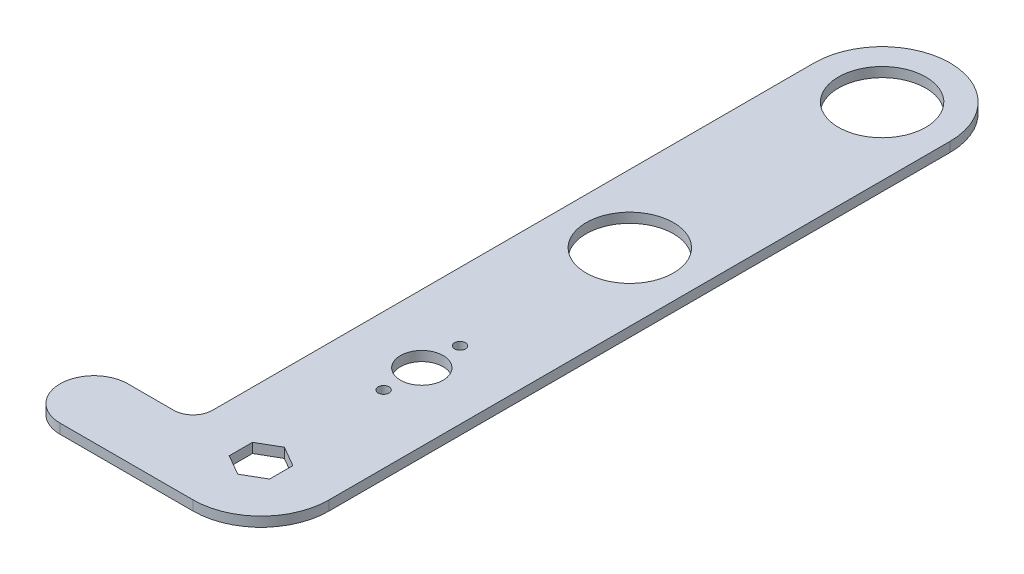
ISO-10303-21;
HEADER;
FILE_DESCRIPTION(('STEP AP214'),'2;1');
FILE_NAME('part.step','',(''),(''),'','','');
FILE_SCHEMA(('AUTOMOTIVE_DESIGN { 1 0 10303 214 1 1 1 1 }'));
ENDSEC;
DATA;
#1=APPLICATION_CONTEXT('core data for automotive mechanical design processes');
#2=APPLICATION_PROTOCOL_DEFINITION('international standard','automotive_design',2000,#1);
#3=PRODUCT_CONTEXT('',#1,'mechanical');
#4=PRODUCT('Part','Part','',(#3));
#5=PRODUCT_RELATED_PRODUCT_CATEGORY('part','',(#4));
#6=PRODUCT_DEFINITION_FORMATION('','',#4);
#7=PRODUCT_DEFINITION_CONTEXT('part definition',#1,'design');
#8=PRODUCT_DEFINITION('design','',#6,#7);
#9=PRODUCT_DEFINITION_SHAPE('','',#8);
#10=(LENGTH_UNIT() NAMED_UNIT(*) SI_UNIT(.MILLI.,.METRE.));
#11=(NAMED_UNIT(*) PLANE_ANGLE_UNIT() SI_UNIT($,.RADIAN.));
#12=(NAMED_UNIT(*) SI_UNIT($,.STERADIAN.) SOLID_ANGLE_UNIT());
#13=UNCERTAINTY_MEASURE_WITH_UNIT(LENGTH_MEASURE(1.E-05),#10,'distance_accuracy_value','');
#14=(GEOMETRIC_REPRESENTATION_CONTEXT(3) GLOBAL_UNCERTAINTY_ASSIGNED_CONTEXT((#13)) GLOBAL_UNIT_ASSIGNED_CONTEXT((#10,
#11,#12)) REPRESENTATION_CONTEXT('',''));
#15=CARTESIAN_POINT('',(0.,0.,0.));
#16=DIRECTION('',(0.,0.,1.));
#17=DIRECTION('',(1.,0.,0.));
#18=AXIS2_PLACEMENT_3D('',#15,#16,#17);
#19=CARTESIAN_POINT('',(22.225,3.175,-203.2));
#20=DIRECTION('',(0.,1.,0.));
#21=DIRECTION('',(0.,0.,-1.));
#22=AXIS2_PLACEMENT_3D('',#19,#20,#21);
#23=PLANE('',#22);
#24=CARTESIAN_POINT('',(22.225,3.175,-40.10406));
#25=DIRECTION('',(0.,-1.,0.));
#26=DIRECTION('',(0.,0.,-1.));
#27=AXIS2_PLACEMENT_3D('',#24,#25,#26);
#28=CIRCLE('',#27,1.778);
#29=CARTESIAN_POINT('',(22.225,3.175,-41.88206));
#30=VERTEX_POINT('',#29);
#31=EDGE_CURVE('E366',#30,#30,#28,.T.);
#32=ORIENTED_EDGE('',*,*,#31,.T.);
#33=EDGE_LOOP('',(#32));
#34=FACE_BOUND('',#33,.T.);
#35=DIRECTION('',(0.866025403784438,0.,0.5));
#36=VECTOR('',#35,1.);
#37=CARTESIAN_POINT('',(22.225,3.175,-7.62564235545658));
#38=LINE('',#37,#36);
#39=CARTESIAN_POINT('',(22.225,3.175,-7.62564235545658));
#40=VERTEX_POINT('',#39);
#41=CARTESIAN_POINT('',(28.829,3.175,-3.81282117772829));
#42=VERTEX_POINT('',#41);
#43=EDGE_CURVE('E154',#40,#42,#38,.T.);
#44=ORIENTED_EDGE('',*,*,#43,.T.);
#45=DIRECTION('',(0.,0.,1.));
#46=VECTOR('',#45,1.);
#47=CARTESIAN_POINT('',(28.829,3.175,-3.81282117772829));
#48=LINE('',#47,#46);
#49=CARTESIAN_POINT('',(28.829,3.175,3.81282117772829));
#50=VERTEX_POINT('',#49);
#51=EDGE_CURVE('E161',#42,#50,#48,.T.);
#52=ORIENTED_EDGE('',*,*,#51,.T.);
#53=DIRECTION('',(-0.866025403784439,0.,0.5));
#54=VECTOR('',#53,1.);
#55=CARTESIAN_POINT('',(28.829,3.175,3.81282117772829));
#56=LINE('',#55,#54);
#57=CARTESIAN_POINT('',(22.225,3.175,7.62564235545658));
#58=VERTEX_POINT('',#57);
#59=EDGE_CURVE('E163',#50,#58,#56,.T.);
#60=ORIENTED_EDGE('',*,*,#59,.T.);
#61=DIRECTION('',(-0.866025403784438,0.,-0.5));
#62=VECTOR('',#61,1.);
#63=CARTESIAN_POINT('',(22.225,3.175,7.62564235545658));
#64=LINE('',#63,#62);
#65=CARTESIAN_POINT('',(15.621,3.175,3.8128211777283));
#66=VERTEX_POINT('',#65);
#67=EDGE_CURVE('E169',#58,#66,#64,.T.);
#68=ORIENTED_EDGE('',*,*,#67,.T.);
#69=DIRECTION('',(0.,0.,-1.));
#70=VECTOR('',#69,1.);
#71=CARTESIAN_POINT('',(15.621,3.175,3.81282117772829));
#72=LINE('',#71,#70);
#73=CARTESIAN_POINT('',(15.621,3.175,-3.81282117772829));
#74=VERTEX_POINT('',#73);
#75=EDGE_CURVE('E156',#66,#74,#72,.T.);
#76=ORIENTED_EDGE('',*,*,#75,.T.);
#77=DIRECTION('',(0.866025403784439,0.,-0.5));
#78=VECTOR('',#77,1.);
#79=CARTESIAN_POINT('',(15.621,3.175,-3.81282117772829));
#80=LINE('',#79,#78);
#81=EDGE_CURVE('E139',#74,#40,#80,.T.);
#82=ORIENTED_EDGE('',*,*,#81,.T.);
#83=EDGE_LOOP('',(#44,#52,#60,#68,#76,#82));
#84=FACE_BOUND('',#83,.T.);
#85=CARTESIAN_POINT('',(22.225,3.175,-120.65));
#86=DIRECTION('',(0.,-1.,0.));
#87=DIRECTION('',(0.,0.,-1.));
#88=AXIS2_PLACEMENT_3D('',#85,#86,#87);
#89=CIRCLE('',#88,14.2875);
#90=CARTESIAN_POINT('',(22.225,3.175,-134.9375));
#91=VERTEX_POINT('',#90);
#92=EDGE_CURVE('E192',#91,#91,#89,.T.);
#93=ORIENTED_EDGE('',*,*,#92,.T.);
#94=EDGE_LOOP('',(#93));
#95=FACE_BOUND('',#94,.T.);
#96=CARTESIAN_POINT('',(22.225,3.175,-203.2));
#97=DIRECTION('',(0.,-1.,0.));
#98=DIRECTION('',(0.,0.,-1.));
#99=AXIS2_PLACEMENT_3D('',#96,#97,#98);
#100=CIRCLE('',#99,22.225);
#101=CARTESIAN_POINT('',(0.,3.175,-203.2));
#102=VERTEX_POINT('',#101);
#103=CARTESIAN_POINT('',(44.45,3.175,-203.2));
#104=VERTEX_POINT('',#103);
#105=EDGE_CURVE('E204',#102,#104,#100,.T.);
#106=ORIENTED_EDGE('',*,*,#105,.F.);
#107=DIRECTION('',(0.,0.,-1.));
#108=VECTOR('',#107,1.);
#109=CARTESIAN_POINT('',(0.,3.175,-6.35000000000004));
#110=LINE('',#109,#108);
#111=CARTESIAN_POINT('',(0.,3.175,-6.35000000000004));
#112=VERTEX_POINT('',#111);
#113=EDGE_CURVE('E226',#112,#102,#110,.T.);
#114=ORIENTED_EDGE('',*,*,#113,.F.);
#115=CARTESIAN_POINT('',(-6.35,3.175,-6.35));
#116=DIRECTION('',(0.,1.,0.));
#117=DIRECTION('',(0.,0.,1.));
#118=AXIS2_PLACEMENT_3D('',#115,#116,#117);
#119=CIRCLE('',#118,6.35);
#120=CARTESIAN_POINT('',(-6.35000000000004,3.175,0.));
#121=VERTEX_POINT('',#120);
#122=EDGE_CURVE('E223',#121,#112,#119,.T.);
#123=ORIENTED_EDGE('',*,*,#122,.F.);
#124=DIRECTION('',(1.,0.,0.));
#125=VECTOR('',#124,1.);
#126=CARTESIAN_POINT('',(-6.35000000000004,3.175,0.));
#127=LINE('',#126,#125);
#128=CARTESIAN_POINT('',(-21.3329954351355,3.175,0.));
#129=VERTEX_POINT('',#128);
#130=EDGE_CURVE('E220',#129,#121,#127,.T.);
#131=ORIENTED_EDGE('',*,*,#130,.F.);
#132=CARTESIAN_POINT('',(-21.3329954351355,3.175,11.1125));
#133=DIRECTION('',(0.,-1.,0.));
#134=DIRECTION('',(0.,0.,-1.));
#135=AXIS2_PLACEMENT_3D('',#132,#133,#134);
#136=CIRCLE('',#135,11.1125);
#137=CARTESIAN_POINT('',(-21.3329954351354,3.175,22.225));
#138=VERTEX_POINT('',#137);
#139=EDGE_CURVE('E217',#138,#129,#136,.T.);
#140=ORIENTED_EDGE('',*,*,#139,.F.);
#141=DIRECTION('',(-1.,0.,0.));
#142=VECTOR('',#141,1.);
#143=CARTESIAN_POINT('',(22.225,3.175,22.225));
#144=LINE('',#143,#142);
#145=CARTESIAN_POINT('',(22.225,3.175,22.225));
#146=VERTEX_POINT('',#145);
#147=EDGE_CURVE('E214',#146,#138,#144,.T.);
#148=ORIENTED_EDGE('',*,*,#147,.F.);
#149=CARTESIAN_POINT('',(22.225,3.175,0.));
#150=DIRECTION('',(0.,-1.,0.));
#151=DIRECTION('',(0.,0.,1.));
#152=AXIS2_PLACEMENT_3D('',#149,#150,#151);
#153=CIRCLE('',#152,22.225);
#154=CARTESIAN_POINT('',(44.45,3.175,0.));
#155=VERTEX_POINT('',#154);
#156=EDGE_CURVE('E211',#155,#146,#153,.T.);
#157=ORIENTED_EDGE('',*,*,#156,.F.);
#158=DIRECTION('',(0.,0.,1.));
#159=VECTOR('',#158,1.);
#160=CARTESIAN_POINT('',(44.45,3.175,0.));
#161=LINE('',#160,#159);
#162=EDGE_CURVE('E207',#104,#155,#161,.T.);
#163=ORIENTED_EDGE('',*,*,#162,.F.);
#164=EDGE_LOOP('',(#106,#114,#123,#131,#140,#148,#157,#163));
#165=FACE_BOUND('',#164,.T.);
#166=CARTESIAN_POINT('',(22.225,3.175,-203.2));
#167=DIRECTION('',(0.,-1.,0.));
#168=DIRECTION('',(0.,0.,-1.));
#169=AXIS2_PLACEMENT_3D('',#166,#167,#168);
#170=CIRCLE('',#169,14.2875);
#171=CARTESIAN_POINT('',(22.225,3.175,-217.4875));
#172=VERTEX_POINT('',#171);
#173=EDGE_CURVE('E198',#172,#172,#170,.T.);
#174=ORIENTED_EDGE('',*,*,#173,.T.);
#175=EDGE_LOOP('',(#174));
#176=FACE_BOUND('',#175,.T.);
#177=CARTESIAN_POINT('',(22.225,3.175,-52.6034));
#178=DIRECTION('',(0.,-1.,0.));
#179=DIRECTION('',(0.,0.,-1.));
#180=AXIS2_PLACEMENT_3D('',#177,#178,#179);
#181=CIRCLE('',#180,6.985);
#182=CARTESIAN_POINT('',(22.225,3.175,-59.5884));
#183=VERTEX_POINT('',#182);
#184=EDGE_CURVE('E174',#183,#183,#181,.T.);
#185=ORIENTED_EDGE('',*,*,#184,.T.);
#186=EDGE_LOOP('',(#185));
#187=FACE_BOUND('',#186,.T.);
#188=CARTESIAN_POINT('',(22.225,3.175,-65.10274));
#189=DIRECTION('',(0.,-1.,0.));
#190=DIRECTION('',(0.,0.,-1.));
#191=AXIS2_PLACEMENT_3D('',#188,#189,#190);
#192=CIRCLE('',#191,1.778);
#193=CARTESIAN_POINT('',(22.225,3.175,-66.88074));
#194=VERTEX_POINT('',#193);
#195=EDGE_CURVE('E357',#194,#194,#192,.T.);
#196=ORIENTED_EDGE('',*,*,#195,.T.);
#197=EDGE_LOOP('',(#196));
#198=FACE_BOUND('',#197,.T.);
#199=ADVANCED_FACE('F37',(#34,#84,#95,#165,#176,#187,#198),#23,.T.);
#200=CARTESIAN_POINT('',(22.225,0.,-203.2));
#201=DIRECTION('',(0.,1.,0.));
#202=DIRECTION('',(0.,0.,-1.));
#203=AXIS2_PLACEMENT_3D('',#200,#201,#202);
#204=PLANE('',#203);
#205=CARTESIAN_POINT('',(22.225,0.,-120.65));
#206=DIRECTION('',(0.,-1.,0.));
#207=DIRECTION('',(0.,0.,-1.));
#208=AXIS2_PLACEMENT_3D('',#205,#206,#207);
#209=CIRCLE('',#208,14.2875);
#210=CARTESIAN_POINT('',(22.225,0.,-134.9375));
#211=VERTEX_POINT('',#210);
#212=EDGE_CURVE('E147',#211,#211,#209,.T.);
#213=ORIENTED_EDGE('',*,*,#212,.F.);
#214=EDGE_LOOP('',(#213));
#215=FACE_BOUND('',#214,.T.);
#216=CARTESIAN_POINT('',(22.225,0.,-203.2));
#217=DIRECTION('',(0.,-1.,0.));
#218=DIRECTION('',(0.,0.,-1.));
#219=AXIS2_PLACEMENT_3D('',#216,#217,#218);
#220=CIRCLE('',#219,14.2875);
#221=CARTESIAN_POINT('',(22.225,0.,-217.4875));
#222=VERTEX_POINT('',#221);
#223=EDGE_CURVE('E195',#222,#222,#220,.T.);
#224=ORIENTED_EDGE('',*,*,#223,.F.);
#225=EDGE_LOOP('',(#224));
#226=FACE_BOUND('',#225,.T.);
#227=CARTESIAN_POINT('',(22.225,0.,-203.2));
#228=DIRECTION('',(0.,-1.,0.));
#229=DIRECTION('',(0.,0.,-1.));
#230=AXIS2_PLACEMENT_3D('',#227,#228,#229);
#231=CIRCLE('',#230,22.225);
#232=CARTESIAN_POINT('',(0.,0.,-203.2));
#233=VERTEX_POINT('',#232);
#234=CARTESIAN_POINT('',(44.45,0.,-203.2));
#235=VERTEX_POINT('',#234);
#236=EDGE_CURVE('E201',#233,#235,#231,.T.);
#237=ORIENTED_EDGE('',*,*,#236,.T.);
#238=DIRECTION('',(0.,0.,1.));
#239=VECTOR('',#238,1.);
#240=CARTESIAN_POINT('',(44.45,0.,0.));
#241=LINE('',#240,#239);
#242=CARTESIAN_POINT('',(44.45,0.,0.));
#243=VERTEX_POINT('',#242);
#244=EDGE_CURVE('E232',#235,#243,#241,.T.);
#245=ORIENTED_EDGE('',*,*,#244,.T.);
#246=CARTESIAN_POINT('',(22.225,0.,0.));
#247=DIRECTION('',(0.,-1.,0.));
#248=DIRECTION('',(0.,0.,1.));
#249=AXIS2_PLACEMENT_3D('',#246,#247,#248);
#250=CIRCLE('',#249,22.225);
#251=CARTESIAN_POINT('',(22.225,0.,22.225));
#252=VERTEX_POINT('',#251);
#253=EDGE_CURVE('E235',#243,#252,#250,.T.);
#254=ORIENTED_EDGE('',*,*,#253,.T.);
#255=DIRECTION('',(-1.,0.,0.));
#256=VECTOR('',#255,1.);
#257=CARTESIAN_POINT('',(22.225,0.,22.225));
#258=LINE('',#257,#256);
#259=CARTESIAN_POINT('',(-21.3329954351354,0.,22.225));
#260=VERTEX_POINT('',#259);
#261=EDGE_CURVE('E238',#252,#260,#258,.T.);
#262=ORIENTED_EDGE('',*,*,#261,.T.);
#263=CARTESIAN_POINT('',(-21.3329954351355,0.,11.1125));
#264=DIRECTION('',(0.,-1.,0.));
#265=DIRECTION('',(0.,0.,-1.));
#266=AXIS2_PLACEMENT_3D('',#263,#264,#265);
#267=CIRCLE('',#266,11.1125);
#268=CARTESIAN_POINT('',(-21.3329954351355,0.,0.));
#269=VERTEX_POINT('',#268);
#270=EDGE_CURVE('E241',#260,#269,#267,.T.);
#271=ORIENTED_EDGE('',*,*,#270,.T.);
#272=DIRECTION('',(1.,0.,0.));
#273=VECTOR('',#272,1.);
#274=CARTESIAN_POINT('',(-6.35000000000004,0.,0.));
#275=LINE('',#274,#273);
#276=CARTESIAN_POINT('',(-6.35000000000004,0.,0.));
#277=VERTEX_POINT('',#276);
#278=EDGE_CURVE('E244',#269,#277,#275,.T.);
#279=ORIENTED_EDGE('',*,*,#278,.T.);
#280=CARTESIAN_POINT('',(-6.35,0.,-6.35));
#281=DIRECTION('',(0.,1.,0.));
#282=DIRECTION('',(0.,0.,1.));
#283=AXIS2_PLACEMENT_3D('',#280,#281,#282);
#284=CIRCLE('',#283,6.35);
#285=CARTESIAN_POINT('',(0.,0.,-6.35000000000004));
#286=VERTEX_POINT('',#285);
#287=EDGE_CURVE('E247',#277,#286,#284,.T.);
#288=ORIENTED_EDGE('',*,*,#287,.T.);
#289=DIRECTION('',(0.,0.,-1.));
#290=VECTOR('',#289,1.);
#291=CARTESIAN_POINT('',(0.,0.,-6.35000000000004));
#292=LINE('',#291,#290);
#293=EDGE_CURVE('E208',#286,#233,#292,.T.);
#294=ORIENTED_EDGE('',*,*,#293,.T.);
#295=EDGE_LOOP('',(#237,#245,#254,#262,#271,#279,#288,#294));
#296=FACE_BOUND('',#295,.T.);
#297=DIRECTION('',(0.866025403784439,0.,-0.5));
#298=VECTOR('',#297,1.);
#299=CARTESIAN_POINT('',(15.621,0.,-3.81282117772829));
#300=LINE('',#299,#298);
#301=CARTESIAN_POINT('',(15.621,0.,-3.8128211777283));
#302=VERTEX_POINT('',#301);
#303=CARTESIAN_POINT('',(22.225,0.,-7.62564235545658));
#304=VERTEX_POINT('',#303);
#305=EDGE_CURVE('E142',#302,#304,#300,.T.);
#306=ORIENTED_EDGE('',*,*,#305,.F.);
#307=DIRECTION('',(0.,0.,-1.));
#308=VECTOR('',#307,1.);
#309=CARTESIAN_POINT('',(15.621,0.,3.81282117772829));
#310=LINE('',#309,#308);
#311=CARTESIAN_POINT('',(15.621,0.,3.81282117772829));
#312=VERTEX_POINT('',#311);
#313=EDGE_CURVE('E157',#312,#302,#310,.T.);
#314=ORIENTED_EDGE('',*,*,#313,.F.);
#315=DIRECTION('',(-0.866025403784438,0.,-0.5));
#316=VECTOR('',#315,1.);
#317=CARTESIAN_POINT('',(22.225,0.,7.62564235545658));
#318=LINE('',#317,#316);
#319=CARTESIAN_POINT('',(22.225,0.,7.62564235545658));
#320=VERTEX_POINT('',#319);
#321=EDGE_CURVE('E182',#320,#312,#318,.T.);
#322=ORIENTED_EDGE('',*,*,#321,.F.);
#323=DIRECTION('',(-0.866025403784439,0.,0.5));
#324=VECTOR('',#323,1.);
#325=CARTESIAN_POINT('',(28.829,0.,3.81282117772829));
#326=LINE('',#325,#324);
#327=CARTESIAN_POINT('',(28.829,0.,3.81282117772829));
#328=VERTEX_POINT('',#327);
#329=EDGE_CURVE('E179',#328,#320,#326,.T.);
#330=ORIENTED_EDGE('',*,*,#329,.F.);
#331=DIRECTION('',(0.,0.,1.));
#332=VECTOR('',#331,1.);
#333=CARTESIAN_POINT('',(28.829,0.,-3.81282117772829));
#334=LINE('',#333,#332);
#335=CARTESIAN_POINT('',(28.829,0.,-3.81282117772829));
#336=VERTEX_POINT('',#335);
#337=EDGE_CURVE('E176',#336,#328,#334,.T.);
#338=ORIENTED_EDGE('',*,*,#337,.F.);
#339=DIRECTION('',(0.866025403784438,0.,0.5));
#340=VECTOR('',#339,1.);
#341=CARTESIAN_POINT('',(22.225,0.,-7.62564235545658));
#342=LINE('',#341,#340);
#343=EDGE_CURVE('E173',#304,#336,#342,.T.);
#344=ORIENTED_EDGE('',*,*,#343,.F.);
#345=EDGE_LOOP('',(#306,#314,#322,#330,#338,#344));
#346=FACE_BOUND('',#345,.T.);
#347=CARTESIAN_POINT('',(22.225,0.,-52.6034));
#348=DIRECTION('',(0.,-1.,0.));
#349=DIRECTION('',(0.,0.,-1.));
#350=AXIS2_PLACEMENT_3D('',#347,#348,#349);
#351=CIRCLE('',#350,6.985);
#352=CARTESIAN_POINT('',(22.225,0.,-59.5884));
#353=VERTEX_POINT('',#352);
#354=EDGE_CURVE('E368',#353,#353,#351,.T.);
#355=ORIENTED_EDGE('',*,*,#354,.F.);
#356=EDGE_LOOP('',(#355));
#357=FACE_BOUND('',#356,.T.);
#358=CARTESIAN_POINT('',(22.225,0.,-40.10406));
#359=DIRECTION('',(0.,-1.,0.));
#360=DIRECTION('',(0.,0.,-1.));
#361=AXIS2_PLACEMENT_3D('',#358,#359,#360);
#362=CIRCLE('',#361,1.778);
#363=CARTESIAN_POINT('',(22.225,0.,-41.88206));
#364=VERTEX_POINT('',#363);
#365=EDGE_CURVE('E363',#364,#364,#362,.T.);
#366=ORIENTED_EDGE('',*,*,#365,.F.);
#367=EDGE_LOOP('',(#366));
#368=FACE_BOUND('',#367,.T.);
#369=CARTESIAN_POINT('',(22.225,0.,-65.10274));
#370=DIRECTION('',(0.,-1.,0.));
#371=DIRECTION('',(0.,0.,-1.));
#372=AXIS2_PLACEMENT_3D('',#369,#370,#371);
#373=CIRCLE('',#372,1.778);
#374=CARTESIAN_POINT('',(22.225,0.,-66.88074));
#375=VERTEX_POINT('',#374);
#376=EDGE_CURVE('E360',#375,#375,#373,.T.);
#377=ORIENTED_EDGE('',*,*,#376,.F.);
#378=EDGE_LOOP('',(#377));
#379=FACE_BOUND('',#378,.T.);
#380=ADVANCED_FACE('F272',(#215,#226,#296,#346,#357,#368,#379),#204,.F.);
#381=CARTESIAN_POINT('',(22.225,3.175,-203.2));
#382=DIRECTION('',(0.,-1.,0.));
#383=DIRECTION('',(0.,0.,1.));
#384=AXIS2_PLACEMENT_3D('',#381,#382,#383);
#385=CYLINDRICAL_SURFACE('',#384,22.225);
#386=ORIENTED_EDGE('',*,*,#236,.F.);
#387=DIRECTION('',(0.,-1.,0.));
#388=VECTOR('',#387,1.);
#389=CARTESIAN_POINT('',(0.,3.175,-203.2));
#390=LINE('',#389,#388);
#391=EDGE_CURVE('E229',#102,#233,#390,.T.);
#392=ORIENTED_EDGE('',*,*,#391,.F.);
#393=ORIENTED_EDGE('',*,*,#105,.T.);
#394=DIRECTION('',(0.,-1.,0.));
#395=VECTOR('',#394,1.);
#396=CARTESIAN_POINT('',(44.45,3.175,-203.2));
#397=LINE('',#396,#395);
#398=EDGE_CURVE('E11',#104,#235,#397,.T.);
#399=ORIENTED_EDGE('',*,*,#398,.T.);
#400=EDGE_LOOP('',(#386,#392,#393,#399));
#401=FACE_BOUND('',#400,.T.);
#402=ADVANCED_FACE('F39',(#401),#385,.T.);
#403=CARTESIAN_POINT('',(44.45,3.175,0.));
#404=DIRECTION('',(-1.,0.,0.));
#405=DIRECTION('',(0.,0.,-1.));
#406=AXIS2_PLACEMENT_3D('',#403,#404,#405);
#407=PLANE('',#406);
#408=ORIENTED_EDGE('',*,*,#244,.F.);
#409=ORIENTED_EDGE('',*,*,#398,.F.);
#410=ORIENTED_EDGE('',*,*,#162,.T.);
#411=DIRECTION('',(0.,-1.,0.));
#412=VECTOR('',#411,1.);
#413=CARTESIAN_POINT('',(44.45,3.175,0.));
#414=LINE('',#413,#412);
#415=EDGE_CURVE('E45',#155,#243,#414,.T.);
#416=ORIENTED_EDGE('',*,*,#415,.T.);
#417=EDGE_LOOP('',(#408,#409,#410,#416));
#418=FACE_BOUND('',#417,.T.);
#419=ADVANCED_FACE('F265',(#418),#407,.F.);
#420=CARTESIAN_POINT('',(22.225,3.175,0.));
#421=DIRECTION('',(0.,-1.,0.));
#422=DIRECTION('',(0.,0.,1.));
#423=AXIS2_PLACEMENT_3D('',#420,#421,#422);
#424=CYLINDRICAL_SURFACE('',#423,22.225);
#425=ORIENTED_EDGE('',*,*,#253,.F.);
#426=ORIENTED_EDGE('',*,*,#415,.F.);
#427=ORIENTED_EDGE('',*,*,#156,.T.);
#428=DIRECTION('',(0.,-1.,0.));
#429=VECTOR('',#428,1.);
#430=CARTESIAN_POINT('',(22.225,3.175,22.225));
#431=LINE('',#430,#429);
#432=EDGE_CURVE('E261',#146,#252,#431,.T.);
#433=ORIENTED_EDGE('',*,*,#432,.T.);
#434=EDGE_LOOP('',(#425,#426,#427,#433));
#435=FACE_BOUND('',#434,.T.);
#436=ADVANCED_FACE('F269',(#435),#424,.T.);
#437=CARTESIAN_POINT('',(22.225,3.175,22.225));
#438=DIRECTION('',(0.,0.,-1.));
#439=DIRECTION('',(1.,0.,0.));
#440=AXIS2_PLACEMENT_3D('',#437,#438,#439);
#441=PLANE('',#440);
#442=ORIENTED_EDGE('',*,*,#261,.F.);
#443=ORIENTED_EDGE('',*,*,#432,.F.);
#444=ORIENTED_EDGE('',*,*,#147,.T.);
#445=DIRECTION('',(0.,-1.,0.));
#446=VECTOR('',#445,1.);
#447=CARTESIAN_POINT('',(-21.3329954351354,3.175,22.225));
#448=LINE('',#447,#446);
#449=EDGE_CURVE('E259',#138,#260,#448,.T.);
#450=ORIENTED_EDGE('',*,*,#449,.T.);
#451=EDGE_LOOP('',(#442,#443,#444,#450));
#452=FACE_BOUND('',#451,.T.);
#453=ADVANCED_FACE('F285',(#452),#441,.F.);
#454=CARTESIAN_POINT('',(-21.3329954351355,3.175,11.1125));
#455=DIRECTION('',(0.,-1.,0.));
#456=DIRECTION('',(0.,0.,1.));
#457=AXIS2_PLACEMENT_3D('',#454,#455,#456);
#458=CYLINDRICAL_SURFACE('',#457,11.1125);
#459=ORIENTED_EDGE('',*,*,#270,.F.);
#460=ORIENTED_EDGE('',*,*,#449,.F.);
#461=ORIENTED_EDGE('',*,*,#139,.T.);
#462=DIRECTION('',(0.,-1.,0.));
#463=VECTOR('',#462,1.);
#464=CARTESIAN_POINT('',(-21.3329954351355,3.175,0.));
#465=LINE('',#464,#463);
#466=EDGE_CURVE('E257',#129,#269,#465,.T.);
#467=ORIENTED_EDGE('',*,*,#466,.T.);
#468=EDGE_LOOP('',(#459,#460,#461,#467));
#469=FACE_BOUND('',#468,.T.);
#470=ADVANCED_FACE('F289',(#469),#458,.T.);
#471=CARTESIAN_POINT('',(-6.35000000000004,3.175,0.));
#472=DIRECTION('',(0.,0.,1.));
#473=DIRECTION('',(-1.,0.,0.));
#474=AXIS2_PLACEMENT_3D('',#471,#472,#473);
#475=PLANE('',#474);
#476=ORIENTED_EDGE('',*,*,#278,.F.);
#477=ORIENTED_EDGE('',*,*,#466,.F.);
#478=ORIENTED_EDGE('',*,*,#130,.T.);
#479=DIRECTION('',(0.,-1.,0.));
#480=VECTOR('',#479,1.);
#481=CARTESIAN_POINT('',(-6.35000000000004,3.175,0.));
#482=LINE('',#481,#480);
#483=EDGE_CURVE('E255',#121,#277,#482,.T.);
#484=ORIENTED_EDGE('',*,*,#483,.T.);
#485=EDGE_LOOP('',(#476,#477,#478,#484));
#486=FACE_BOUND('',#485,.T.);
#487=ADVANCED_FACE('F291',(#486),#475,.F.);
#488=CARTESIAN_POINT('',(-6.35,3.175,-6.35));
#489=DIRECTION('',(0.,-1.,0.));
#490=DIRECTION('',(0.,0.,1.));
#491=AXIS2_PLACEMENT_3D('',#488,#489,#490);
#492=CYLINDRICAL_SURFACE('',#491,6.35);
#493=ORIENTED_EDGE('',*,*,#287,.F.);
#494=ORIENTED_EDGE('',*,*,#483,.F.);
#495=ORIENTED_EDGE('',*,*,#122,.T.);
#496=DIRECTION('',(0.,-1.,0.));
#497=VECTOR('',#496,1.);
#498=CARTESIAN_POINT('',(0.,3.175,-6.35000000000004));
#499=LINE('',#498,#497);
#500=EDGE_CURVE('E253',#112,#286,#499,.T.);
#501=ORIENTED_EDGE('',*,*,#500,.T.);
#502=EDGE_LOOP('',(#493,#494,#495,#501));
#503=FACE_BOUND('',#502,.T.);
#504=ADVANCED_FACE('F295',(#503),#492,.F.);
#505=CARTESIAN_POINT('',(0.,3.175,-6.35000000000004));
#506=DIRECTION('',(1.,0.,0.));
#507=DIRECTION('',(0.,0.,1.));
#508=AXIS2_PLACEMENT_3D('',#505,#506,#507);
#509=PLANE('',#508);
#510=ORIENTED_EDGE('',*,*,#293,.F.);
#511=ORIENTED_EDGE('',*,*,#500,.F.);
#512=ORIENTED_EDGE('',*,*,#113,.T.);
#513=ORIENTED_EDGE('',*,*,#391,.T.);
#514=EDGE_LOOP('',(#510,#511,#512,#513));
#515=FACE_BOUND('',#514,.T.);
#516=ADVANCED_FACE('F297',(#515),#509,.F.);
#517=CARTESIAN_POINT('',(22.225,3.175,-203.2));
#518=DIRECTION('',(0.,-1.,0.));
#519=DIRECTION('',(0.,0.,1.));
#520=AXIS2_PLACEMENT_3D('',#517,#518,#519);
#521=CYLINDRICAL_SURFACE('',#520,14.2875);
#522=ORIENTED_EDGE('',*,*,#173,.F.);
#523=EDGE_LOOP('',(#522));
#524=FACE_BOUND('',#523,.T.);
#525=ORIENTED_EDGE('',*,*,#223,.T.);
#526=EDGE_LOOP('',(#525));
#527=FACE_BOUND('',#526,.T.);
#528=ADVANCED_FACE('F299',(#524,#527),#521,.F.);
#529=CARTESIAN_POINT('',(22.225,3.175,-120.65));
#530=DIRECTION('',(0.,-1.,0.));
#531=DIRECTION('',(0.,0.,1.));
#532=AXIS2_PLACEMENT_3D('',#529,#530,#531);
#533=CYLINDRICAL_SURFACE('',#532,14.2875);
#534=ORIENTED_EDGE('',*,*,#92,.F.);
#535=EDGE_LOOP('',(#534));
#536=FACE_BOUND('',#535,.T.);
#537=ORIENTED_EDGE('',*,*,#212,.T.);
#538=EDGE_LOOP('',(#537));
#539=FACE_BOUND('',#538,.T.);
#540=ADVANCED_FACE('F305',(#536,#539),#533,.F.);
#541=CARTESIAN_POINT('',(15.621,3.175,-3.81282117772829));
#542=DIRECTION('',(0.5,0.,0.866025403784439));
#543=DIRECTION('',(-0.866025403784439,0.,0.5));
#544=AXIS2_PLACEMENT_3D('',#541,#542,#543);
#545=PLANE('',#544);
#546=ORIENTED_EDGE('',*,*,#305,.T.);
#547=DIRECTION('',(0.,-1.,0.));
#548=VECTOR('',#547,1.);
#549=CARTESIAN_POINT('',(22.225,3.175,-7.62564235545658));
#550=LINE('',#549,#548);
#551=EDGE_CURVE('E136',#40,#304,#550,.T.);
#552=ORIENTED_EDGE('',*,*,#551,.F.);
#553=ORIENTED_EDGE('',*,*,#81,.F.);
#554=DIRECTION('',(0.,-1.,0.));
#555=VECTOR('',#554,1.);
#556=CARTESIAN_POINT('',(15.621,3.175,-3.81282117772829));
#557=LINE('',#556,#555);
#558=EDGE_CURVE('E60',#74,#302,#557,.T.);
#559=ORIENTED_EDGE('',*,*,#558,.T.);
#560=EDGE_LOOP('',(#546,#552,#553,#559));
#561=FACE_BOUND('',#560,.T.);
#562=ADVANCED_FACE('F138',(#561),#545,.T.);
#563=CARTESIAN_POINT('',(22.225,3.175,-7.62564235545658));
#564=DIRECTION('',(-0.5,0.,0.866025403784438));
#565=DIRECTION('',(-0.866025403784438,0.,-0.5));
#566=AXIS2_PLACEMENT_3D('',#563,#564,#565);
#567=PLANE('',#566);
#568=ORIENTED_EDGE('',*,*,#343,.T.);
#569=DIRECTION('',(0.,-1.,0.));
#570=VECTOR('',#569,1.);
#571=CARTESIAN_POINT('',(28.829,3.175,-3.81282117772829));
#572=LINE('',#571,#570);
#573=EDGE_CURVE('E148',#42,#336,#572,.T.);
#574=ORIENTED_EDGE('',*,*,#573,.F.);
#575=ORIENTED_EDGE('',*,*,#43,.F.);
#576=ORIENTED_EDGE('',*,*,#551,.T.);
#577=EDGE_LOOP('',(#568,#574,#575,#576));
#578=FACE_BOUND('',#577,.T.);
#579=ADVANCED_FACE('F159',(#578),#567,.T.);
#580=CARTESIAN_POINT('',(28.829,3.175,-3.81282117772829));
#581=DIRECTION('',(-1.,0.,0.));
#582=DIRECTION('',(0.,0.,-1.));
#583=AXIS2_PLACEMENT_3D('',#580,#581,#582);
#584=PLANE('',#583);
#585=ORIENTED_EDGE('',*,*,#337,.T.);
#586=DIRECTION('',(0.,-1.,0.));
#587=VECTOR('',#586,1.);
#588=CARTESIAN_POINT('',(28.829,3.175,3.81282117772829));
#589=LINE('',#588,#587);
#590=EDGE_CURVE('E189',#50,#328,#589,.T.);
#591=ORIENTED_EDGE('',*,*,#590,.F.);
#592=ORIENTED_EDGE('',*,*,#51,.F.);
#593=ORIENTED_EDGE('',*,*,#573,.T.);
#594=EDGE_LOOP('',(#585,#591,#592,#593));
#595=FACE_BOUND('',#594,.T.);
#596=ADVANCED_FACE('F326',(#595),#584,.T.);
#597=CARTESIAN_POINT('',(28.829,3.175,3.81282117772829));
#598=DIRECTION('',(-0.5,0.,-0.866025403784439));
#599=DIRECTION('',(0.866025403784439,0.,-0.5));
#600=AXIS2_PLACEMENT_3D('',#597,#598,#599);
#601=PLANE('',#600);
#602=ORIENTED_EDGE('',*,*,#329,.T.);
#603=DIRECTION('',(0.,-1.,0.));
#604=VECTOR('',#603,1.);
#605=CARTESIAN_POINT('',(22.225,3.175,7.62564235545658));
#606=LINE('',#605,#604);
#607=EDGE_CURVE('E187',#58,#320,#606,.T.);
#608=ORIENTED_EDGE('',*,*,#607,.F.);
#609=ORIENTED_EDGE('',*,*,#59,.F.);
#610=ORIENTED_EDGE('',*,*,#590,.T.);
#611=EDGE_LOOP('',(#602,#608,#609,#610));
#612=FACE_BOUND('',#611,.T.);
#613=ADVANCED_FACE('F329',(#612),#601,.T.);
#614=CARTESIAN_POINT('',(22.225,3.175,7.62564235545658));
#615=DIRECTION('',(0.5,0.,-0.866025403784438));
#616=DIRECTION('',(0.866025403784438,0.,0.5));
#617=AXIS2_PLACEMENT_3D('',#614,#615,#616);
#618=PLANE('',#617);
#619=ORIENTED_EDGE('',*,*,#321,.T.);
#620=DIRECTION('',(0.,-1.,0.));
#621=VECTOR('',#620,1.);
#622=CARTESIAN_POINT('',(15.621,3.175,3.81282117772829));
#623=LINE('',#622,#621);
#624=EDGE_CURVE('E52',#66,#312,#623,.T.);
#625=ORIENTED_EDGE('',*,*,#624,.F.);
#626=ORIENTED_EDGE('',*,*,#67,.F.);
#627=ORIENTED_EDGE('',*,*,#607,.T.);
#628=EDGE_LOOP('',(#619,#625,#626,#627));
#629=FACE_BOUND('',#628,.T.);
#630=ADVANCED_FACE('F333',(#629),#618,.T.);
#631=CARTESIAN_POINT('',(15.621,3.175,3.81282117772829));
#632=DIRECTION('',(1.,0.,0.));
#633=DIRECTION('',(0.,0.,1.));
#634=AXIS2_PLACEMENT_3D('',#631,#632,#633);
#635=PLANE('',#634);
#636=ORIENTED_EDGE('',*,*,#313,.T.);
#637=ORIENTED_EDGE('',*,*,#558,.F.);
#638=ORIENTED_EDGE('',*,*,#75,.F.);
#639=ORIENTED_EDGE('',*,*,#624,.T.);
#640=EDGE_LOOP('',(#636,#637,#638,#639));
#641=FACE_BOUND('',#640,.T.);
#642=ADVANCED_FACE('F337',(#641),#635,.T.);
#643=CARTESIAN_POINT('',(22.225,3.175,-52.6034));
#644=DIRECTION('',(0.,-1.,0.));
#645=DIRECTION('',(0.,0.,1.));
#646=AXIS2_PLACEMENT_3D('',#643,#644,#645);
#647=CYLINDRICAL_SURFACE('',#646,6.985);
#648=ORIENTED_EDGE('',*,*,#184,.F.);
#649=EDGE_LOOP('',(#648));
#650=FACE_BOUND('',#649,.T.);
#651=ORIENTED_EDGE('',*,*,#354,.T.);
#652=EDGE_LOOP('',(#651));
#653=FACE_BOUND('',#652,.T.);
#654=ADVANCED_FACE('F340',(#650,#653),#647,.F.);
#655=CARTESIAN_POINT('',(22.225,3.175,-40.10406));
#656=DIRECTION('',(0.,-1.,0.));
#657=DIRECTION('',(0.,0.,1.));
#658=AXIS2_PLACEMENT_3D('',#655,#656,#657);
#659=CYLINDRICAL_SURFACE('',#658,1.778);
#660=ORIENTED_EDGE('',*,*,#31,.F.);
#661=EDGE_LOOP('',(#660));
#662=FACE_BOUND('',#661,.T.);
#663=ORIENTED_EDGE('',*,*,#365,.T.);
#664=EDGE_LOOP('',(#663));
#665=FACE_BOUND('',#664,.T.);
#666=ADVANCED_FACE('F344',(#662,#665),#659,.F.);
#667=CARTESIAN_POINT('',(22.225,3.175,-65.10274));
#668=DIRECTION('',(0.,-1.,0.));
#669=DIRECTION('',(0.,0.,1.));
#670=AXIS2_PLACEMENT_3D('',#667,#668,#669);
#671=CYLINDRICAL_SURFACE('',#670,1.778);
#672=ORIENTED_EDGE('',*,*,#195,.F.);
#673=EDGE_LOOP('',(#672));
#674=FACE_BOUND('',#673,.T.);
#675=ORIENTED_EDGE('',*,*,#376,.T.);
#676=EDGE_LOOP('',(#675));
#677=FACE_BOUND('',#676,.T.);
#678=ADVANCED_FACE('F348',(#674,#677),#671,.F.);
#679=CLOSED_SHELL('',(#199,#380,#402,#419,#436,#453,#470,#487,#504,#516,#528,#540,#562,#579,
#596,#613,#630,#642,#654,#666,#678));
#680=MANIFOLD_SOLID_BREP('B2',#679);
#681=ADVANCED_BREP_SHAPE_REPRESENTATION('',(#18,#680),#14);
#682=SHAPE_DEFINITION_REPRESENTATION(#9,#681);
ENDSEC;
END-ISO-10303-21;
